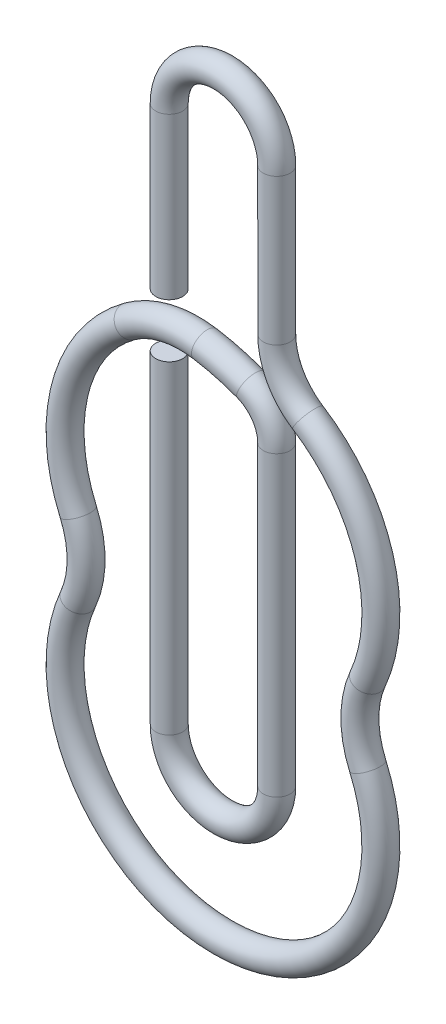
ISO-10303-21;
HEADER;
FILE_DESCRIPTION(('STEP AP214'),'2;1');
FILE_NAME('part.step','',(''),(''),'','','');
FILE_SCHEMA(('AUTOMOTIVE_DESIGN { 1 0 10303 214 1 1 1 1 }'));
ENDSEC;
DATA;
#1=APPLICATION_CONTEXT('core data for automotive mechanical design processes');
#2=APPLICATION_PROTOCOL_DEFINITION('international standard','automotive_design',2000,#1);
#3=PRODUCT_CONTEXT('',#1,'mechanical');
#4=PRODUCT('Part','Part','',(#3));
#5=PRODUCT_RELATED_PRODUCT_CATEGORY('part','',(#4));
#6=PRODUCT_DEFINITION_FORMATION('','',#4);
#7=PRODUCT_DEFINITION_CONTEXT('part definition',#1,'design');
#8=PRODUCT_DEFINITION('design','',#6,#7);
#9=PRODUCT_DEFINITION_SHAPE('','',#8);
#10=(LENGTH_UNIT() NAMED_UNIT(*) SI_UNIT(.MILLI.,.METRE.));
#11=(NAMED_UNIT(*) PLANE_ANGLE_UNIT() SI_UNIT($,.RADIAN.));
#12=(NAMED_UNIT(*) SI_UNIT($,.STERADIAN.) SOLID_ANGLE_UNIT());
#13=UNCERTAINTY_MEASURE_WITH_UNIT(LENGTH_MEASURE(1.E-05),#10,'distance_accuracy_value','');
#14=(GEOMETRIC_REPRESENTATION_CONTEXT(3) GLOBAL_UNCERTAINTY_ASSIGNED_CONTEXT((#13)) GLOBAL_UNIT_ASSIGNED_CONTEXT((#10,
#11,#12)) REPRESENTATION_CONTEXT('',''));
#15=CARTESIAN_POINT('',(0.,0.,0.));
#16=DIRECTION('',(0.,0.,1.));
#17=DIRECTION('',(1.,0.,0.));
#18=AXIS2_PLACEMENT_3D('',#15,#16,#17);
#19=CARTESIAN_POINT('',(-8.00000000000001,-14.9999999999996,0.));
#20=DIRECTION('',(0.,1.,0.));
#21=DIRECTION('',(-1.,0.,0.));
#22=AXIS2_PLACEMENT_3D('',#19,#20,#21);
#23=CYLINDRICAL_SURFACE('',#22,2.);
#24=CARTESIAN_POINT('',(-8.00000000000001,-14.9999999999996,0.));
#25=DIRECTION('',(0.,-1.,0.));
#26=DIRECTION('',(1.,0.,0.));
#27=AXIS2_PLACEMENT_3D('',#24,#25,#26);
#28=CIRCLE('',#27,2.);
#29=CARTESIAN_POINT('',(-10.,-14.9999999999995,0.));
#30=VERTEX_POINT('',#29);
#31=EDGE_CURVE('E37',#30,#30,#28,.T.);
#32=ORIENTED_EDGE('',*,*,#31,.F.);
#33=EDGE_LOOP('',(#32));
#34=FACE_BOUND('',#33,.T.);
#35=CARTESIAN_POINT('',(-8.00000000000002,33.0963797939848,0.));
#36=DIRECTION('',(0.,-1.,0.));
#37=DIRECTION('',(1.,0.,0.));
#38=AXIS2_PLACEMENT_3D('',#35,#36,#37);
#39=CIRCLE('',#38,2.);
#40=CARTESIAN_POINT('',(-6.00000000000002,33.0963797939847,0.));
#41=VERTEX_POINT('',#40);
#42=EDGE_CURVE('E10',#41,#41,#39,.T.);
#43=ORIENTED_EDGE('',*,*,#42,.T.);
#44=EDGE_LOOP('',(#43));
#45=FACE_BOUND('',#44,.T.);
#46=ADVANCED_FACE('F31',(#34,#45),#23,.T.);
#47=CARTESIAN_POINT('',(0.,-15.,0.));
#48=DIRECTION('',(0.,0.,-1.));
#49=DIRECTION('',(-1.,0.,0.));
#50=AXIS2_PLACEMENT_3D('',#47,#48,#49);
#51=TOROIDAL_SURFACE('',#50,8.00000000000002,2.);
#52=CARTESIAN_POINT('',(8.00000000000003,-15.0000000000003,0.));
#53=DIRECTION('',(0.,1.,0.));
#54=DIRECTION('',(-1.,0.,0.));
#55=AXIS2_PLACEMENT_3D('',#52,#53,#54);
#56=CIRCLE('',#55,2.);
#57=CARTESIAN_POINT('',(10.,-15.0000000000004,0.));
#58=VERTEX_POINT('',#57);
#59=EDGE_CURVE('E41',#58,#58,#56,.T.);
#60=CARTESIAN_POINT('',(0.,-15.,0.));
#61=DIRECTION('',(0.,0.,-1.));
#62=DIRECTION('',(-1.,0.,0.));
#63=AXIS2_PLACEMENT_3D('',#60,#61,#62);
#64=CIRCLE('',#63,10.);
#65=EDGE_CURVE('',#58,#30,#64,.T.);
#66=ORIENTED_EDGE('',*,*,#59,.F.);
#67=ORIENTED_EDGE('',*,*,#31,.T.);
#68=ORIENTED_EDGE('',*,*,#65,.T.);
#69=ORIENTED_EDGE('',*,*,#65,.F.);
#70=EDGE_LOOP('',(#66,#68,#67,#69));
#71=FACE_BOUND('',#70,.T.);
#72=ADVANCED_FACE('F159',(#71),#51,.T.);
#73=CARTESIAN_POINT('',(8.00000000000002,29.2497734552281,0.));
#74=DIRECTION('',(0.,-1.,0.));
#75=DIRECTION('',(1.,0.,0.));
#76=AXIS2_PLACEMENT_3D('',#73,#74,#75);
#77=CYLINDRICAL_SURFACE('',#76,2.);
#78=CARTESIAN_POINT('',(8.00000000000002,29.2497734552281,0.));
#79=DIRECTION('',(0.,1.,0.));
#80=DIRECTION('',(-1.,0.,0.));
#81=AXIS2_PLACEMENT_3D('',#78,#79,#80);
#82=CIRCLE('',#81,2.);
#83=CARTESIAN_POINT('',(10.,29.249773455228,0.));
#84=VERTEX_POINT('',#83);
#85=EDGE_CURVE('E45',#84,#84,#82,.T.);
#86=ORIENTED_EDGE('',*,*,#85,.F.);
#87=EDGE_LOOP('',(#86));
#88=FACE_BOUND('',#87,.T.);
#89=ORIENTED_EDGE('',*,*,#59,.T.);
#90=EDGE_LOOP('',(#89));
#91=FACE_BOUND('',#90,.T.);
#92=ADVANCED_FACE('F153',(#88,#91),#77,.T.);
#93=CARTESIAN_POINT('',(2.,29.2497734552284,0.));
#94=DIRECTION('',(0.,0.,-1.));
#95=DIRECTION('',(-1.,0.,0.));
#96=AXIS2_PLACEMENT_3D('',#93,#94,#95);
#97=TOROIDAL_SURFACE('',#96,6.00000000000001,2.);
#98=CARTESIAN_POINT('',(4.14285714285745,34.8540720969234,0.));
#99=DIRECTION('',(-0.934049773615854,0.35714285714287,0.));
#100=DIRECTION('',(-0.35714285714287,-0.934049773615854,0.));
#101=AXIS2_PLACEMENT_3D('',#98,#99,#100);
#102=CIRCLE('',#101,2.);
#103=CARTESIAN_POINT('',(4.85714285714326,36.7221716441551,0.));
#104=VERTEX_POINT('',#103);
#105=EDGE_CURVE('E50',#104,#104,#102,.T.);
#106=CARTESIAN_POINT('',(2.,29.2497734552284,0.));
#107=DIRECTION('',(0.,0.,-1.));
#108=DIRECTION('',(-1.,0.,0.));
#109=AXIS2_PLACEMENT_3D('',#106,#107,#108);
#110=CIRCLE('',#109,8.00000000000001);
#111=EDGE_CURVE('',#104,#84,#110,.T.);
#112=ORIENTED_EDGE('',*,*,#105,.F.);
#113=ORIENTED_EDGE('',*,*,#85,.T.);
#114=ORIENTED_EDGE('',*,*,#111,.T.);
#115=ORIENTED_EDGE('',*,*,#111,.F.);
#116=EDGE_LOOP('',(#112,#114,#113,#115));
#117=FACE_BOUND('',#116,.T.);
#118=ADVANCED_FACE('F147',(#117),#97,.T.);
#119=CARTESIAN_POINT('',(-7.99999999999999,3.09637979398435,0.));
#120=DIRECTION('',(0.,0.,-1.));
#121=DIRECTION('',(-1.,0.,0.));
#122=AXIS2_PLACEMENT_3D('',#119,#120,#121);
#123=TOROIDAL_SURFACE('',#122,34.,2.);
#124=CARTESIAN_POINT('',(-2.66343205294618,36.6749599090887,0.));
#125=DIRECTION('',(-0.987605297503067,0.156957880795705,0.));
#126=DIRECTION('',(-0.156957880795705,-0.987605297503067,0.));
#127=AXIS2_PLACEMENT_3D('',#124,#125,#126);
#128=CIRCLE('',#127,2.);
#129=CARTESIAN_POINT('',(-2.34951629135477,38.6501705040948,0.));
#130=VERTEX_POINT('',#129);
#131=EDGE_CURVE('E53',#130,#130,#128,.T.);
#132=CARTESIAN_POINT('',(-7.99999999999999,3.09637979398435,0.));
#133=DIRECTION('',(0.,0.,-1.));
#134=DIRECTION('',(-1.,0.,0.));
#135=AXIS2_PLACEMENT_3D('',#132,#133,#134);
#136=CIRCLE('',#135,36.);
#137=EDGE_CURVE('',#130,#104,#136,.T.);
#138=ORIENTED_EDGE('',*,*,#131,.F.);
#139=ORIENTED_EDGE('',*,*,#105,.T.);
#140=ORIENTED_EDGE('',*,*,#137,.T.);
#141=ORIENTED_EDGE('',*,*,#137,.F.);
#142=EDGE_LOOP('',(#138,#140,#139,#141));
#143=FACE_BOUND('',#142,.T.);
#144=ADVANCED_FACE('F141',(#143),#123,.T.);
#145=CARTESIAN_POINT('',(-5.01780026488186,21.8608804465427,0.));
#146=DIRECTION('',(0.,0.,-1.));
#147=DIRECTION('',(-1.,0.,0.));
#148=AXIS2_PLACEMENT_3D('',#145,#146,#147);
#149=TOROIDAL_SURFACE('',#148,15.,2.);
#150=CARTESIAN_POINT('',(-13.8727419087908,33.968316528677,0.));
#151=DIRECTION('',(-0.807162405475616,-0.590329442927267,0.));
#152=DIRECTION('',(0.590329442927267,-0.807162405475616,0.));
#153=AXIS2_PLACEMENT_3D('',#150,#151,#152);
#154=CIRCLE('',#153,2.);
#155=CARTESIAN_POINT('',(-15.0534007946453,35.5826413396282,0.));
#156=VERTEX_POINT('',#155);
#157=EDGE_CURVE('E56',#156,#156,#154,.T.);
#158=CARTESIAN_POINT('',(-5.01780026488186,21.8608804465427,0.));
#159=DIRECTION('',(0.,0.,-1.));
#160=DIRECTION('',(-1.,0.,0.));
#161=AXIS2_PLACEMENT_3D('',#158,#159,#160);
#162=CIRCLE('',#161,17.);
#163=EDGE_CURVE('',#156,#130,#162,.T.);
#164=ORIENTED_EDGE('',*,*,#157,.F.);
#165=ORIENTED_EDGE('',*,*,#131,.T.);
#166=ORIENTED_EDGE('',*,*,#163,.T.);
#167=ORIENTED_EDGE('',*,*,#163,.F.);
#168=EDGE_LOOP('',(#164,#166,#165,#167));
#169=FACE_BOUND('',#168,.T.);
#170=ADVANCED_FACE('F135',(#169),#149,.T.);
#171=CARTESIAN_POINT('',(0.,15.,0.));
#172=DIRECTION('',(0.,0.,-1.));
#173=DIRECTION('',(-1.,0.,0.));
#174=AXIS2_PLACEMENT_3D('',#171,#172,#173);
#175=TOROIDAL_SURFACE('',#174,23.5,2.);
#176=CARTESIAN_POINT('',(-21.5381057662926,5.60000000000029,0.));
#177=DIRECTION('',(0.399999999999987,-0.916515138991174,0.));
#178=DIRECTION('',(0.916515138991174,0.399999999999987,0.));
#179=AXIS2_PLACEMENT_3D('',#176,#177,#178);
#180=CIRCLE('',#179,2.);
#181=CARTESIAN_POINT('',(-23.3711360442749,4.80000000000032,0.));
#182=VERTEX_POINT('',#181);
#183=EDGE_CURVE('E59',#182,#182,#180,.T.);
#184=CARTESIAN_POINT('',(0.,15.,0.));
#185=DIRECTION('',(0.,0.,-1.));
#186=DIRECTION('',(-1.,0.,0.));
#187=AXIS2_PLACEMENT_3D('',#184,#185,#186);
#188=CIRCLE('',#187,25.5);
#189=EDGE_CURVE('',#182,#156,#188,.T.);
#190=ORIENTED_EDGE('',*,*,#183,.F.);
#191=ORIENTED_EDGE('',*,*,#157,.T.);
#192=ORIENTED_EDGE('',*,*,#189,.T.);
#193=ORIENTED_EDGE('',*,*,#189,.F.);
#194=EDGE_LOOP('',(#190,#192,#191,#193));
#195=FACE_BOUND('',#194,.T.);
#196=ADVANCED_FACE('F129',(#195),#175,.T.);
#197=CARTESIAN_POINT('',(-34.3693177121688,0.,0.));
#198=DIRECTION('',(0.,0.,1.));
#199=DIRECTION('',(1.,0.,0.));
#200=AXIS2_PLACEMENT_3D('',#197,#198,#199);
#201=TOROIDAL_SURFACE('',#200,14.,2.);
#202=CARTESIAN_POINT('',(-21.5381057662923,-5.5999999999997,0.));
#203=DIRECTION('',(-0.400000000000012,-0.916515138991163,0.));
#204=DIRECTION('',(0.916515138991163,-0.400000000000012,0.));
#205=AXIS2_PLACEMENT_3D('',#202,#203,#204);
#206=CIRCLE('',#205,2.);
#207=CARTESIAN_POINT('',(-23.3711360442746,-4.79999999999968,0.));
#208=VERTEX_POINT('',#207);
#209=EDGE_CURVE('E62',#208,#208,#206,.T.);
#210=ORIENTED_EDGE('',*,*,#209,.F.);
#211=EDGE_LOOP('',(#210));
#212=FACE_BOUND('',#211,.T.);
#213=ORIENTED_EDGE('',*,*,#183,.T.);
#214=EDGE_LOOP('',(#213));
#215=FACE_BOUND('',#214,.T.);
#216=ADVANCED_FACE('F123',(#212,#215),#201,.T.);
#217=CARTESIAN_POINT('',(0.,-15.,0.));
#218=DIRECTION('',(0.,0.,-1.));
#219=DIRECTION('',(-1.,0.,0.));
#220=AXIS2_PLACEMENT_3D('',#217,#218,#219);
#221=TOROIDAL_SURFACE('',#220,23.5,2.);
#222=CARTESIAN_POINT('',(21.5381057662924,-5.6,0.));
#223=DIRECTION('',(-0.4,0.916515138991168,0.));
#224=DIRECTION('',(-0.916515138991168,-0.4,0.));
#225=AXIS2_PLACEMENT_3D('',#222,#223,#224);
#226=CIRCLE('',#225,2.);
#227=CARTESIAN_POINT('',(23.3711360442748,-4.8,0.));
#228=VERTEX_POINT('',#227);
#229=EDGE_CURVE('E65',#228,#228,#226,.T.);
#230=CARTESIAN_POINT('',(0.,-15.,0.));
#231=DIRECTION('',(0.,0.,-1.));
#232=DIRECTION('',(-1.,0.,0.));
#233=AXIS2_PLACEMENT_3D('',#230,#231,#232);
#234=CIRCLE('',#233,25.5);
#235=EDGE_CURVE('',#228,#208,#234,.T.);
#236=ORIENTED_EDGE('',*,*,#229,.F.);
#237=ORIENTED_EDGE('',*,*,#209,.T.);
#238=ORIENTED_EDGE('',*,*,#235,.T.);
#239=ORIENTED_EDGE('',*,*,#235,.F.);
#240=EDGE_LOOP('',(#236,#238,#237,#239));
#241=FACE_BOUND('',#240,.T.);
#242=ADVANCED_FACE('F117',(#241),#221,.T.);
#243=CARTESIAN_POINT('',(34.3693177121688,0.,0.));
#244=DIRECTION('',(0.,0.,1.));
#245=DIRECTION('',(1.,0.,0.));
#246=AXIS2_PLACEMENT_3D('',#243,#244,#245);
#247=TOROIDAL_SURFACE('',#246,14.,2.);
#248=CARTESIAN_POINT('',(21.5381057662924,5.60000000000001,0.));
#249=DIRECTION('',(0.4,0.916515138991168,0.));
#250=DIRECTION('',(-0.916515138991168,0.4,0.));
#251=AXIS2_PLACEMENT_3D('',#248,#249,#250);
#252=CIRCLE('',#251,2.);
#253=CARTESIAN_POINT('',(23.3711360442748,4.80000000000001,0.));
#254=VERTEX_POINT('',#253);
#255=EDGE_CURVE('E68',#254,#254,#252,.T.);
#256=ORIENTED_EDGE('',*,*,#255,.F.);
#257=EDGE_LOOP('',(#256));
#258=FACE_BOUND('',#257,.T.);
#259=ORIENTED_EDGE('',*,*,#229,.T.);
#260=EDGE_LOOP('',(#259));
#261=FACE_BOUND('',#260,.T.);
#262=ADVANCED_FACE('F111',(#258,#261),#247,.T.);
#263=CARTESIAN_POINT('',(0.,15.,0.));
#264=DIRECTION('',(0.,0.,-1.));
#265=DIRECTION('',(-1.,0.,0.));
#266=AXIS2_PLACEMENT_3D('',#263,#264,#265);
#267=TOROIDAL_SURFACE('',#266,23.5,2.);
#268=CARTESIAN_POINT('',(12.6268656716418,34.8194920043455,0.));
#269=DIRECTION('',(-0.843382638482786,0.537313432835821,0.));
#270=DIRECTION('',(-0.537313432835821,-0.843382638482786,0.));
#271=AXIS2_PLACEMENT_3D('',#268,#269,#270);
#272=CIRCLE('',#271,2.);
#273=CARTESIAN_POINT('',(13.7014925373134,36.506257281311,0.));
#274=VERTEX_POINT('',#273);
#275=EDGE_CURVE('E71',#274,#274,#272,.T.);
#276=CARTESIAN_POINT('',(0.,15.,0.));
#277=DIRECTION('',(0.,0.,-1.));
#278=DIRECTION('',(-1.,0.,0.));
#279=AXIS2_PLACEMENT_3D('',#276,#277,#278);
#280=CIRCLE('',#279,25.5);
#281=EDGE_CURVE('',#274,#254,#280,.T.);
#282=ORIENTED_EDGE('',*,*,#275,.F.);
#283=ORIENTED_EDGE('',*,*,#255,.T.);
#284=ORIENTED_EDGE('',*,*,#281,.T.);
#285=ORIENTED_EDGE('',*,*,#281,.F.);
#286=EDGE_LOOP('',(#282,#284,#283,#285));
#287=FACE_BOUND('',#286,.T.);
#288=ADVANCED_FACE('F105',(#287),#267,.T.);
#289=CARTESIAN_POINT('',(18.,43.2533183891733,0.));
#290=DIRECTION('',(0.,0.,1.));
#291=DIRECTION('',(1.,0.,0.));
#292=AXIS2_PLACEMENT_3D('',#289,#290,#291);
#293=TOROIDAL_SURFACE('',#292,9.99999999999999,2.);
#294=CARTESIAN_POINT('',(8.,43.2533183891733,0.));
#295=DIRECTION('',(0.,1.,0.));
#296=DIRECTION('',(-1.,0.,0.));
#297=AXIS2_PLACEMENT_3D('',#294,#295,#296);
#298=CIRCLE('',#297,2.);
#299=CARTESIAN_POINT('',(6.,43.2533183891733,0.));
#300=VERTEX_POINT('',#299);
#301=EDGE_CURVE('E74',#300,#300,#298,.T.);
#302=ORIENTED_EDGE('',*,*,#301,.F.);
#303=EDGE_LOOP('',(#302));
#304=FACE_BOUND('',#303,.T.);
#305=ORIENTED_EDGE('',*,*,#275,.T.);
#306=EDGE_LOOP('',(#305));
#307=FACE_BOUND('',#306,.T.);
#308=ADVANCED_FACE('F99',(#304,#307),#293,.T.);
#309=CARTESIAN_POINT('',(7.99999999999999,65.,0.));
#310=DIRECTION('',(0.,-1.,0.));
#311=DIRECTION('',(1.,0.,0.));
#312=AXIS2_PLACEMENT_3D('',#309,#310,#311);
#313=CYLINDRICAL_SURFACE('',#312,2.);
#314=CARTESIAN_POINT('',(7.99999999999999,65.,0.));
#315=DIRECTION('',(0.,1.,0.));
#316=DIRECTION('',(-1.,0.,0.));
#317=AXIS2_PLACEMENT_3D('',#314,#315,#316);
#318=CIRCLE('',#317,2.);
#319=CARTESIAN_POINT('',(9.99999999999999,65.,0.));
#320=VERTEX_POINT('',#319);
#321=EDGE_CURVE('E77',#320,#320,#318,.T.);
#322=ORIENTED_EDGE('',*,*,#321,.F.);
#323=EDGE_LOOP('',(#322));
#324=FACE_BOUND('',#323,.T.);
#325=ORIENTED_EDGE('',*,*,#301,.T.);
#326=EDGE_LOOP('',(#325));
#327=FACE_BOUND('',#326,.T.);
#328=ADVANCED_FACE('F93',(#324,#327),#313,.T.);
#329=CARTESIAN_POINT('',(0.,65.,0.));
#330=DIRECTION('',(0.,0.,-1.));
#331=DIRECTION('',(-1.,0.,0.));
#332=AXIS2_PLACEMENT_3D('',#329,#330,#331);
#333=TOROIDAL_SURFACE('',#332,8.,2.);
#334=CARTESIAN_POINT('',(-8.00000000000001,65.,0.));
#335=DIRECTION('',(0.,-1.,0.));
#336=DIRECTION('',(1.,0.,0.));
#337=AXIS2_PLACEMENT_3D('',#334,#335,#336);
#338=CIRCLE('',#337,2.);
#339=CARTESIAN_POINT('',(-10.,65.,0.));
#340=VERTEX_POINT('',#339);
#341=EDGE_CURVE('E80',#340,#340,#338,.T.);
#342=CARTESIAN_POINT('',(0.,65.,0.));
#343=DIRECTION('',(0.,0.,-1.));
#344=DIRECTION('',(-1.,0.,0.));
#345=AXIS2_PLACEMENT_3D('',#342,#343,#344);
#346=CIRCLE('',#345,10.);
#347=EDGE_CURVE('',#340,#320,#346,.T.);
#348=ORIENTED_EDGE('',*,*,#341,.F.);
#349=ORIENTED_EDGE('',*,*,#321,.T.);
#350=ORIENTED_EDGE('',*,*,#347,.T.);
#351=ORIENTED_EDGE('',*,*,#347,.F.);
#352=EDGE_LOOP('',(#348,#350,#349,#351));
#353=FACE_BOUND('',#352,.T.);
#354=ADVANCED_FACE('F90',(#353),#333,.T.);
#355=CARTESIAN_POINT('',(-8.00000000000001,65.,0.));
#356=DIRECTION('',(0.,-1.,0.));
#357=DIRECTION('',(0.,0.,-1.));
#358=AXIS2_PLACEMENT_3D('',#355,#356,#357);
#359=CYLINDRICAL_SURFACE('',#358,2.);
#360=ORIENTED_EDGE('',*,*,#341,.T.);
#361=EDGE_LOOP('',(#360));
#362=FACE_BOUND('',#361,.T.);
#363=CARTESIAN_POINT('',(-8.00000000000001,41.0963797939844,0.));
#364=DIRECTION('',(0.,-1.,0.));
#365=DIRECTION('',(1.,0.,0.));
#366=AXIS2_PLACEMENT_3D('',#363,#364,#365);
#367=CIRCLE('',#366,2.);
#368=CARTESIAN_POINT('',(-6.00000000000001,41.0963797939844,0.));
#369=VERTEX_POINT('',#368);
#370=EDGE_CURVE('E81',#369,#369,#367,.T.);
#371=ORIENTED_EDGE('',*,*,#370,.F.);
#372=EDGE_LOOP('',(#371));
#373=FACE_BOUND('',#372,.T.);
#374=ADVANCED_FACE('F87',(#362,#373),#359,.T.);
#375=CARTESIAN_POINT('',(-8.00000000000002,33.0963797939848,0.));
#376=DIRECTION('',(0.,-1.,0.));
#377=DIRECTION('',(1.,0.,0.));
#378=AXIS2_PLACEMENT_3D('',#375,#376,#377);
#379=PLANE('',#378);
#380=ORIENTED_EDGE('',*,*,#42,.F.);
#381=EDGE_LOOP('',(#380));
#382=FACE_BOUND('',#381,.T.);
#383=ADVANCED_FACE('F171',(#382),#379,.F.);
#384=CARTESIAN_POINT('',(-8.00000000000001,41.0963797939844,0.));
#385=DIRECTION('',(0.,-1.,0.));
#386=DIRECTION('',(1.,0.,0.));
#387=AXIS2_PLACEMENT_3D('',#384,#385,#386);
#388=PLANE('',#387);
#389=ORIENTED_EDGE('',*,*,#370,.T.);
#390=EDGE_LOOP('',(#389));
#391=FACE_BOUND('',#390,.T.);
#392=ADVANCED_FACE('F172',(#391),#388,.T.);
#393=CLOSED_SHELL('',(#46,#72,#92,#118,#144,#170,#196,#216,#242,#262,#288,#308,#328,#354,#374,
#383,#392));
#394=MANIFOLD_SOLID_BREP('B2',#393);
#395=ADVANCED_BREP_SHAPE_REPRESENTATION('',(#18,#394),#14);
#396=SHAPE_DEFINITION_REPRESENTATION(#9,#395);
ENDSEC;
END-ISO-10303-21;
